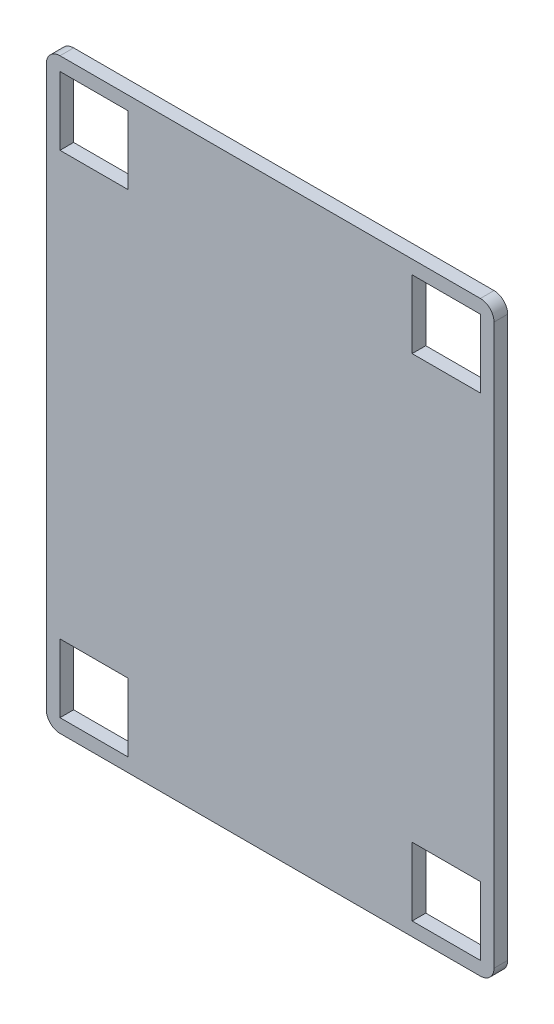
ISO-10303-21;
HEADER;
FILE_DESCRIPTION(('STEP AP214'),'2;1');
FILE_NAME('part.step','',(''),(''),'','','');
FILE_SCHEMA(('AUTOMOTIVE_DESIGN { 1 0 10303 214 1 1 1 1 }'));
ENDSEC;
DATA;
#1=APPLICATION_CONTEXT('core data for automotive mechanical design processes');
#2=APPLICATION_PROTOCOL_DEFINITION('international standard','automotive_design',2000,#1);
#3=PRODUCT_CONTEXT('',#1,'mechanical');
#4=PRODUCT('Part','Part','',(#3));
#5=PRODUCT_RELATED_PRODUCT_CATEGORY('part','',(#4));
#6=PRODUCT_DEFINITION_FORMATION('','',#4);
#7=PRODUCT_DEFINITION_CONTEXT('part definition',#1,'design');
#8=PRODUCT_DEFINITION('design','',#6,#7);
#9=PRODUCT_DEFINITION_SHAPE('','',#8);
#10=(LENGTH_UNIT() NAMED_UNIT(*) SI_UNIT(.MILLI.,.METRE.));
#11=(NAMED_UNIT(*) PLANE_ANGLE_UNIT() SI_UNIT($,.RADIAN.));
#12=(NAMED_UNIT(*) SI_UNIT($,.STERADIAN.) SOLID_ANGLE_UNIT());
#13=UNCERTAINTY_MEASURE_WITH_UNIT(LENGTH_MEASURE(1.E-05),#10,'distance_accuracy_value','');
#14=(GEOMETRIC_REPRESENTATION_CONTEXT(3) GLOBAL_UNCERTAINTY_ASSIGNED_CONTEXT((#13)) GLOBAL_UNIT_ASSIGNED_CONTEXT((#10,
#11,#12)) REPRESENTATION_CONTEXT('',''));
#15=CARTESIAN_POINT('',(0.,0.,0.));
#16=DIRECTION('',(0.,0.,1.));
#17=DIRECTION('',(1.,0.,0.));
#18=AXIS2_PLACEMENT_3D('',#15,#16,#17);
#19=CARTESIAN_POINT('',(0.,0.,5.));
#20=DIRECTION('',(0.,0.,-1.));
#21=DIRECTION('',(-1.,0.,0.));
#22=AXIS2_PLACEMENT_3D('',#19,#20,#21);
#23=PLANE('',#22);
#24=DIRECTION('',(0.,-1.,0.));
#25=VECTOR('',#24,1.);
#26=CARTESIAN_POINT('',(52.,-102.5,5.));
#27=LINE('',#26,#25);
#28=CARTESIAN_POINT('',(52.,-77.5,5.));
#29=VERTEX_POINT('',#28);
#30=CARTESIAN_POINT('',(52.,-102.5,5.));
#31=VERTEX_POINT('',#30);
#32=EDGE_CURVE('E239',#29,#31,#27,.T.);
#33=ORIENTED_EDGE('',*,*,#32,.F.);
#34=DIRECTION('',(-1.,0.,0.));
#35=VECTOR('',#34,1.);
#36=CARTESIAN_POINT('',(52.,-77.5,5.));
#37=LINE('',#36,#35);
#38=CARTESIAN_POINT('',(77.,-77.5,5.));
#39=VERTEX_POINT('',#38);
#40=EDGE_CURVE('E247',#39,#29,#37,.T.);
#41=ORIENTED_EDGE('',*,*,#40,.F.);
#42=DIRECTION('',(0.,1.,0.));
#43=VECTOR('',#42,1.);
#44=CARTESIAN_POINT('',(77.,-77.5,5.));
#45=LINE('',#44,#43);
#46=CARTESIAN_POINT('',(77.,-102.5,5.));
#47=VERTEX_POINT('',#46);
#48=EDGE_CURVE('E244',#47,#39,#45,.T.);
#49=ORIENTED_EDGE('',*,*,#48,.F.);
#50=DIRECTION('',(1.,0.,0.));
#51=VECTOR('',#50,1.);
#52=CARTESIAN_POINT('',(77.,-102.5,5.));
#53=LINE('',#52,#51);
#54=EDGE_CURVE('E241',#31,#47,#53,.T.);
#55=ORIENTED_EDGE('',*,*,#54,.F.);
#56=EDGE_LOOP('',(#33,#41,#49,#55));
#57=FACE_BOUND('',#56,.T.);
#58=DIRECTION('',(0.,-1.,0.));
#59=VECTOR('',#58,1.);
#60=CARTESIAN_POINT('',(-77.0000000000001,77.5,5.));
#61=LINE('',#60,#59);
#62=CARTESIAN_POINT('',(-77.0000000000001,102.5,5.));
#63=VERTEX_POINT('',#62);
#64=CARTESIAN_POINT('',(-77.0000000000001,77.5,5.));
#65=VERTEX_POINT('',#64);
#66=EDGE_CURVE('E300',#63,#65,#61,.T.);
#67=ORIENTED_EDGE('',*,*,#66,.F.);
#68=DIRECTION('',(-1.,0.,0.));
#69=VECTOR('',#68,1.);
#70=CARTESIAN_POINT('',(-77.0000000000001,102.5,5.));
#71=LINE('',#70,#69);
#72=CARTESIAN_POINT('',(-52.,102.5,5.));
#73=VERTEX_POINT('',#72);
#74=EDGE_CURVE('E308',#73,#63,#71,.T.);
#75=ORIENTED_EDGE('',*,*,#74,.F.);
#76=DIRECTION('',(0.,1.,0.));
#77=VECTOR('',#76,1.);
#78=CARTESIAN_POINT('',(-52.,102.5,5.));
#79=LINE('',#78,#77);
#80=CARTESIAN_POINT('',(-52.,77.5000000000001,5.));
#81=VERTEX_POINT('',#80);
#82=EDGE_CURVE('E305',#81,#73,#79,.T.);
#83=ORIENTED_EDGE('',*,*,#82,.F.);
#84=DIRECTION('',(1.,0.,0.));
#85=VECTOR('',#84,1.);
#86=CARTESIAN_POINT('',(-52.,77.5000000000001,5.));
#87=LINE('',#86,#85);
#88=EDGE_CURVE('E302',#65,#81,#87,.T.);
#89=ORIENTED_EDGE('',*,*,#88,.F.);
#90=EDGE_LOOP('',(#67,#75,#83,#89));
#91=FACE_BOUND('',#90,.T.);
#92=DIRECTION('',(0.,-1.,0.));
#93=VECTOR('',#92,1.);
#94=CARTESIAN_POINT('',(-82.,-107.5,5.));
#95=LINE('',#94,#93);
#96=CARTESIAN_POINT('',(-82.,102.5,5.));
#97=VERTEX_POINT('',#96);
#98=CARTESIAN_POINT('',(-82.,-102.5,5.));
#99=VERTEX_POINT('',#98);
#100=EDGE_CURVE('E331',#97,#99,#95,.T.);
#101=ORIENTED_EDGE('',*,*,#100,.T.);
#102=CARTESIAN_POINT('',(-77.,-102.5,5.));
#103=DIRECTION('',(0.,0.,-1.));
#104=DIRECTION('',(-1.,0.,0.));
#105=AXIS2_PLACEMENT_3D('',#102,#103,#104);
#106=CIRCLE('',#105,5.);
#107=CARTESIAN_POINT('',(-77.,-107.5,5.));
#108=VERTEX_POINT('',#107);
#109=EDGE_CURVE('E374',#99,#108,#106,.F.);
#110=ORIENTED_EDGE('',*,*,#109,.T.);
#111=DIRECTION('',(1.,0.,0.));
#112=VECTOR('',#111,1.);
#113=CARTESIAN_POINT('',(82.,-107.5,5.));
#114=LINE('',#113,#112);
#115=CARTESIAN_POINT('',(77.,-107.5,5.));
#116=VERTEX_POINT('',#115);
#117=EDGE_CURVE('E334',#108,#116,#114,.T.);
#118=ORIENTED_EDGE('',*,*,#117,.T.);
#119=CARTESIAN_POINT('',(77.,-102.5,5.));
#120=DIRECTION('',(0.,0.,-1.));
#121=DIRECTION('',(-1.,0.,0.));
#122=AXIS2_PLACEMENT_3D('',#119,#120,#121);
#123=CIRCLE('',#122,5.);
#124=CARTESIAN_POINT('',(82.,-102.5,5.));
#125=VERTEX_POINT('',#124);
#126=EDGE_CURVE('E372',#116,#125,#123,.F.);
#127=ORIENTED_EDGE('',*,*,#126,.T.);
#128=DIRECTION('',(0.,1.,0.));
#129=VECTOR('',#128,1.);
#130=CARTESIAN_POINT('',(82.,107.5,5.));
#131=LINE('',#130,#129);
#132=CARTESIAN_POINT('',(82.,102.5,5.));
#133=VERTEX_POINT('',#132);
#134=EDGE_CURVE('E338',#125,#133,#131,.T.);
#135=ORIENTED_EDGE('',*,*,#134,.T.);
#136=CARTESIAN_POINT('',(77.,102.5,5.));
#137=DIRECTION('',(0.,0.,-1.));
#138=DIRECTION('',(-1.,0.,0.));
#139=AXIS2_PLACEMENT_3D('',#136,#137,#138);
#140=CIRCLE('',#139,5.);
#141=CARTESIAN_POINT('',(77.,107.5,5.));
#142=VERTEX_POINT('',#141);
#143=EDGE_CURVE('E54',#133,#142,#140,.F.);
#144=ORIENTED_EDGE('',*,*,#143,.T.);
#145=DIRECTION('',(-1.,0.,0.));
#146=VECTOR('',#145,1.);
#147=CARTESIAN_POINT('',(-82.,107.5,5.));
#148=LINE('',#147,#146);
#149=CARTESIAN_POINT('',(-77.,107.5,5.));
#150=VERTEX_POINT('',#149);
#151=EDGE_CURVE('E340',#142,#150,#148,.T.);
#152=ORIENTED_EDGE('',*,*,#151,.T.);
#153=CARTESIAN_POINT('',(-77.,102.5,5.));
#154=DIRECTION('',(0.,0.,-1.));
#155=DIRECTION('',(-1.,0.,0.));
#156=AXIS2_PLACEMENT_3D('',#153,#154,#155);
#157=CIRCLE('',#156,5.);
#158=EDGE_CURVE('E369',#150,#97,#157,.F.);
#159=ORIENTED_EDGE('',*,*,#158,.T.);
#160=EDGE_LOOP('',(#101,#110,#118,#127,#135,#144,#152,#159));
#161=FACE_BOUND('',#160,.T.);
#162=DIRECTION('',(0.,-1.,0.));
#163=VECTOR('',#162,1.);
#164=CARTESIAN_POINT('',(52.,102.5,5.));
#165=LINE('',#164,#163);
#166=CARTESIAN_POINT('',(52.,102.5,5.));
#167=VERTEX_POINT('',#166);
#168=CARTESIAN_POINT('',(52.,77.5,5.));
#169=VERTEX_POINT('',#168);
#170=EDGE_CURVE('E196',#167,#169,#165,.T.);
#171=ORIENTED_EDGE('',*,*,#170,.F.);
#172=DIRECTION('',(-1.,0.,0.));
#173=VECTOR('',#172,1.);
#174=CARTESIAN_POINT('',(77.,102.5,5.));
#175=LINE('',#174,#173);
#176=CARTESIAN_POINT('',(77.,102.5,5.));
#177=VERTEX_POINT('',#176);
#178=EDGE_CURVE('E222',#177,#167,#175,.T.);
#179=ORIENTED_EDGE('',*,*,#178,.F.);
#180=DIRECTION('',(0.,1.,0.));
#181=VECTOR('',#180,1.);
#182=CARTESIAN_POINT('',(77.,77.5,5.));
#183=LINE('',#182,#181);
#184=CARTESIAN_POINT('',(77.,77.5,5.));
#185=VERTEX_POINT('',#184);
#186=EDGE_CURVE('E220',#185,#177,#183,.T.);
#187=ORIENTED_EDGE('',*,*,#186,.F.);
#188=DIRECTION('',(1.,0.,0.));
#189=VECTOR('',#188,1.);
#190=CARTESIAN_POINT('',(52.,77.5,5.));
#191=LINE('',#190,#189);
#192=EDGE_CURVE('E206',#169,#185,#191,.T.);
#193=ORIENTED_EDGE('',*,*,#192,.F.);
#194=EDGE_LOOP('',(#171,#179,#187,#193));
#195=FACE_BOUND('',#194,.T.);
#196=DIRECTION('',(1.,0.,0.));
#197=VECTOR('',#196,1.);
#198=CARTESIAN_POINT('',(-76.9999999999999,-102.5,5.));
#199=LINE('',#198,#197);
#200=CARTESIAN_POINT('',(-76.9999999999999,-102.5,5.));
#201=VERTEX_POINT('',#200);
#202=CARTESIAN_POINT('',(-51.9999999999999,-102.5,5.));
#203=VERTEX_POINT('',#202);
#204=EDGE_CURVE('E270',#201,#203,#199,.T.);
#205=ORIENTED_EDGE('',*,*,#204,.F.);
#206=DIRECTION('',(0.,-1.,0.));
#207=VECTOR('',#206,1.);
#208=CARTESIAN_POINT('',(-76.9999999999999,-77.5,5.));
#209=LINE('',#208,#207);
#210=CARTESIAN_POINT('',(-76.9999999999999,-77.5,5.));
#211=VERTEX_POINT('',#210);
#212=EDGE_CURVE('E278',#211,#201,#209,.T.);
#213=ORIENTED_EDGE('',*,*,#212,.F.);
#214=DIRECTION('',(-1.,0.,0.));
#215=VECTOR('',#214,1.);
#216=CARTESIAN_POINT('',(-51.9999999999999,-77.5,5.));
#217=LINE('',#216,#215);
#218=CARTESIAN_POINT('',(-51.9999999999999,-77.5,5.));
#219=VERTEX_POINT('',#218);
#220=EDGE_CURVE('E275',#219,#211,#217,.T.);
#221=ORIENTED_EDGE('',*,*,#220,.F.);
#222=DIRECTION('',(0.,1.,0.));
#223=VECTOR('',#222,1.);
#224=CARTESIAN_POINT('',(-51.9999999999999,-102.5,5.));
#225=LINE('',#224,#223);
#226=EDGE_CURVE('E272',#203,#219,#225,.T.);
#227=ORIENTED_EDGE('',*,*,#226,.F.);
#228=EDGE_LOOP('',(#205,#213,#221,#227));
#229=FACE_BOUND('',#228,.T.);
#230=ADVANCED_FACE('F33',(#57,#91,#161,#195,#229),#23,.F.);
#231=CARTESIAN_POINT('',(0.,0.,0.));
#232=DIRECTION('',(0.,0.,-1.));
#233=DIRECTION('',(-1.,0.,0.));
#234=AXIS2_PLACEMENT_3D('',#231,#232,#233);
#235=PLANE('',#234);
#236=DIRECTION('',(1.,0.,0.));
#237=VECTOR('',#236,1.);
#238=CARTESIAN_POINT('',(82.,-107.5,0.));
#239=LINE('',#238,#237);
#240=CARTESIAN_POINT('',(-77.,-107.5,0.));
#241=VERTEX_POINT('',#240);
#242=CARTESIAN_POINT('',(77.,-107.5,0.));
#243=VERTEX_POINT('',#242);
#244=EDGE_CURVE('E345',#241,#243,#239,.T.);
#245=ORIENTED_EDGE('',*,*,#244,.F.);
#246=CARTESIAN_POINT('',(-77.,-102.5,0.));
#247=DIRECTION('',(0.,0.,-1.));
#248=DIRECTION('',(-1.,0.,0.));
#249=AXIS2_PLACEMENT_3D('',#246,#247,#248);
#250=CIRCLE('',#249,5.);
#251=CARTESIAN_POINT('',(-82.,-102.5,0.));
#252=VERTEX_POINT('',#251);
#253=EDGE_CURVE('E362',#241,#252,#250,.T.);
#254=ORIENTED_EDGE('',*,*,#253,.T.);
#255=DIRECTION('',(0.,-1.,0.));
#256=VECTOR('',#255,1.);
#257=CARTESIAN_POINT('',(-82.,-107.5,0.));
#258=LINE('',#257,#256);
#259=CARTESIAN_POINT('',(-82.,102.5,0.));
#260=VERTEX_POINT('',#259);
#261=EDGE_CURVE('E330',#260,#252,#258,.T.);
#262=ORIENTED_EDGE('',*,*,#261,.F.);
#263=CARTESIAN_POINT('',(-77.,102.5,0.));
#264=DIRECTION('',(0.,0.,-1.));
#265=DIRECTION('',(-1.,0.,0.));
#266=AXIS2_PLACEMENT_3D('',#263,#264,#265);
#267=CIRCLE('',#266,5.);
#268=CARTESIAN_POINT('',(-77.,107.5,0.));
#269=VERTEX_POINT('',#268);
#270=EDGE_CURVE('E356',#260,#269,#267,.T.);
#271=ORIENTED_EDGE('',*,*,#270,.T.);
#272=DIRECTION('',(-1.,0.,0.));
#273=VECTOR('',#272,1.);
#274=CARTESIAN_POINT('',(-82.,107.5,0.));
#275=LINE('',#274,#273);
#276=CARTESIAN_POINT('',(77.,107.5,0.));
#277=VERTEX_POINT('',#276);
#278=EDGE_CURVE('E335',#277,#269,#275,.T.);
#279=ORIENTED_EDGE('',*,*,#278,.F.);
#280=CARTESIAN_POINT('',(77.,102.5,0.));
#281=DIRECTION('',(0.,0.,-1.));
#282=DIRECTION('',(-1.,0.,0.));
#283=AXIS2_PLACEMENT_3D('',#280,#281,#282);
#284=CIRCLE('',#283,5.);
#285=CARTESIAN_POINT('',(82.,102.5,0.));
#286=VERTEX_POINT('',#285);
#287=EDGE_CURVE('E358',#277,#286,#284,.T.);
#288=ORIENTED_EDGE('',*,*,#287,.T.);
#289=DIRECTION('',(0.,1.,0.));
#290=VECTOR('',#289,1.);
#291=CARTESIAN_POINT('',(82.,107.5,0.));
#292=LINE('',#291,#290);
#293=CARTESIAN_POINT('',(82.,-102.5,0.));
#294=VERTEX_POINT('',#293);
#295=EDGE_CURVE('E348',#294,#286,#292,.T.);
#296=ORIENTED_EDGE('',*,*,#295,.F.);
#297=CARTESIAN_POINT('',(77.,-102.5,0.));
#298=DIRECTION('',(0.,0.,-1.));
#299=DIRECTION('',(-1.,0.,0.));
#300=AXIS2_PLACEMENT_3D('',#297,#298,#299);
#301=CIRCLE('',#300,5.);
#302=EDGE_CURVE('E360',#294,#243,#301,.T.);
#303=ORIENTED_EDGE('',*,*,#302,.T.);
#304=EDGE_LOOP('',(#245,#254,#262,#271,#279,#288,#296,#303));
#305=FACE_BOUND('',#304,.T.);
#306=DIRECTION('',(-1.,0.,0.));
#307=VECTOR('',#306,1.);
#308=CARTESIAN_POINT('',(-77.0000000000001,102.5,0.));
#309=LINE('',#308,#307);
#310=CARTESIAN_POINT('',(-52.,102.5,0.));
#311=VERTEX_POINT('',#310);
#312=CARTESIAN_POINT('',(-77.0000000000001,102.5,0.));
#313=VERTEX_POINT('',#312);
#314=EDGE_CURVE('E303',#311,#313,#309,.T.);
#315=ORIENTED_EDGE('',*,*,#314,.T.);
#316=DIRECTION('',(0.,-1.,0.));
#317=VECTOR('',#316,1.);
#318=CARTESIAN_POINT('',(-77.0000000000001,77.5,0.));
#319=LINE('',#318,#317);
#320=CARTESIAN_POINT('',(-77.0000000000001,77.5,0.));
#321=VERTEX_POINT('',#320);
#322=EDGE_CURVE('E214',#313,#321,#319,.T.);
#323=ORIENTED_EDGE('',*,*,#322,.T.);
#324=DIRECTION('',(1.,0.,0.));
#325=VECTOR('',#324,1.);
#326=CARTESIAN_POINT('',(-52.,77.5000000000001,0.));
#327=LINE('',#326,#325);
#328=CARTESIAN_POINT('',(-52.,77.5000000000001,0.));
#329=VERTEX_POINT('',#328);
#330=EDGE_CURVE('E313',#321,#329,#327,.T.);
#331=ORIENTED_EDGE('',*,*,#330,.T.);
#332=DIRECTION('',(0.,1.,0.));
#333=VECTOR('',#332,1.);
#334=CARTESIAN_POINT('',(-52.,102.5,0.));
#335=LINE('',#334,#333);
#336=EDGE_CURVE('E316',#329,#311,#335,.T.);
#337=ORIENTED_EDGE('',*,*,#336,.T.);
#338=EDGE_LOOP('',(#315,#323,#331,#337));
#339=FACE_BOUND('',#338,.T.);
#340=DIRECTION('',(-1.,0.,0.));
#341=VECTOR('',#340,1.);
#342=CARTESIAN_POINT('',(77.,102.5,0.));
#343=LINE('',#342,#341);
#344=CARTESIAN_POINT('',(77.,102.5,0.));
#345=VERTEX_POINT('',#344);
#346=CARTESIAN_POINT('',(52.,102.5,0.));
#347=VERTEX_POINT('',#346);
#348=EDGE_CURVE('E207',#345,#347,#343,.T.);
#349=ORIENTED_EDGE('',*,*,#348,.T.);
#350=DIRECTION('',(0.,-1.,0.));
#351=VECTOR('',#350,1.);
#352=CARTESIAN_POINT('',(52.,102.5,0.));
#353=LINE('',#352,#351);
#354=CARTESIAN_POINT('',(52.,77.5,0.));
#355=VERTEX_POINT('',#354);
#356=EDGE_CURVE('E226',#347,#355,#353,.T.);
#357=ORIENTED_EDGE('',*,*,#356,.T.);
#358=DIRECTION('',(1.,0.,0.));
#359=VECTOR('',#358,1.);
#360=CARTESIAN_POINT('',(52.,77.5,0.));
#361=LINE('',#360,#359);
#362=CARTESIAN_POINT('',(77.,77.5,0.));
#363=VERTEX_POINT('',#362);
#364=EDGE_CURVE('E213',#355,#363,#361,.T.);
#365=ORIENTED_EDGE('',*,*,#364,.T.);
#366=DIRECTION('',(0.,1.,0.));
#367=VECTOR('',#366,1.);
#368=CARTESIAN_POINT('',(77.,77.5,0.));
#369=LINE('',#368,#367);
#370=EDGE_CURVE('E230',#363,#345,#369,.T.);
#371=ORIENTED_EDGE('',*,*,#370,.T.);
#372=EDGE_LOOP('',(#349,#357,#365,#371));
#373=FACE_BOUND('',#372,.T.);
#374=DIRECTION('',(-1.,0.,0.));
#375=VECTOR('',#374,1.);
#376=CARTESIAN_POINT('',(52.,-77.5,0.));
#377=LINE('',#376,#375);
#378=CARTESIAN_POINT('',(77.,-77.5,0.));
#379=VERTEX_POINT('',#378);
#380=CARTESIAN_POINT('',(52.,-77.5,0.));
#381=VERTEX_POINT('',#380);
#382=EDGE_CURVE('E242',#379,#381,#377,.T.);
#383=ORIENTED_EDGE('',*,*,#382,.T.);
#384=DIRECTION('',(0.,-1.,0.));
#385=VECTOR('',#384,1.);
#386=CARTESIAN_POINT('',(52.,-102.5,0.));
#387=LINE('',#386,#385);
#388=CARTESIAN_POINT('',(52.,-102.5,0.));
#389=VERTEX_POINT('',#388);
#390=EDGE_CURVE('E250',#381,#389,#387,.T.);
#391=ORIENTED_EDGE('',*,*,#390,.T.);
#392=DIRECTION('',(1.,0.,0.));
#393=VECTOR('',#392,1.);
#394=CARTESIAN_POINT('',(77.,-102.5,0.));
#395=LINE('',#394,#393);
#396=CARTESIAN_POINT('',(77.,-102.5,0.));
#397=VERTEX_POINT('',#396);
#398=EDGE_CURVE('E253',#389,#397,#395,.T.);
#399=ORIENTED_EDGE('',*,*,#398,.T.);
#400=DIRECTION('',(0.,1.,0.));
#401=VECTOR('',#400,1.);
#402=CARTESIAN_POINT('',(77.,-77.5,0.));
#403=LINE('',#402,#401);
#404=EDGE_CURVE('E257',#397,#379,#403,.T.);
#405=ORIENTED_EDGE('',*,*,#404,.T.);
#406=EDGE_LOOP('',(#383,#391,#399,#405));
#407=FACE_BOUND('',#406,.T.);
#408=DIRECTION('',(0.,-1.,0.));
#409=VECTOR('',#408,1.);
#410=CARTESIAN_POINT('',(-76.9999999999999,-77.5,0.));
#411=LINE('',#410,#409);
#412=CARTESIAN_POINT('',(-76.9999999999999,-77.5,0.));
#413=VERTEX_POINT('',#412);
#414=CARTESIAN_POINT('',(-76.9999999999999,-102.5,0.));
#415=VERTEX_POINT('',#414);
#416=EDGE_CURVE('E273',#413,#415,#411,.T.);
#417=ORIENTED_EDGE('',*,*,#416,.T.);
#418=DIRECTION('',(1.,0.,0.));
#419=VECTOR('',#418,1.);
#420=CARTESIAN_POINT('',(-76.9999999999999,-102.5,0.));
#421=LINE('',#420,#419);
#422=CARTESIAN_POINT('',(-51.9999999999999,-102.5,0.));
#423=VERTEX_POINT('',#422);
#424=EDGE_CURVE('E281',#415,#423,#421,.T.);
#425=ORIENTED_EDGE('',*,*,#424,.T.);
#426=DIRECTION('',(0.,1.,0.));
#427=VECTOR('',#426,1.);
#428=CARTESIAN_POINT('',(-51.9999999999999,-102.5,0.));
#429=LINE('',#428,#427);
#430=CARTESIAN_POINT('',(-51.9999999999999,-77.5,0.));
#431=VERTEX_POINT('',#430);
#432=EDGE_CURVE('E284',#423,#431,#429,.T.);
#433=ORIENTED_EDGE('',*,*,#432,.T.);
#434=DIRECTION('',(-1.,0.,0.));
#435=VECTOR('',#434,1.);
#436=CARTESIAN_POINT('',(-51.9999999999999,-77.5,0.));
#437=LINE('',#436,#435);
#438=EDGE_CURVE('E287',#431,#413,#437,.T.);
#439=ORIENTED_EDGE('',*,*,#438,.T.);
#440=EDGE_LOOP('',(#417,#425,#433,#439));
#441=FACE_BOUND('',#440,.T.);
#442=ADVANCED_FACE('F390',(#305,#339,#373,#407,#441),#235,.T.);
#443=CARTESIAN_POINT('',(-82.,-107.5,5.));
#444=DIRECTION('',(1.,0.,0.));
#445=DIRECTION('',(0.,0.,-1.));
#446=AXIS2_PLACEMENT_3D('',#443,#444,#445);
#447=PLANE('',#446);
#448=ORIENTED_EDGE('',*,*,#261,.T.);
#449=DIRECTION('',(0.,0.,-1.));
#450=VECTOR('',#449,1.);
#451=CARTESIAN_POINT('',(-82.,-102.5,5.));
#452=LINE('',#451,#450);
#453=EDGE_CURVE('E367',#252,#99,#452,.F.);
#454=ORIENTED_EDGE('',*,*,#453,.T.);
#455=ORIENTED_EDGE('',*,*,#100,.F.);
#456=DIRECTION('',(0.,0.,-1.));
#457=VECTOR('',#456,1.);
#458=CARTESIAN_POINT('',(-82.,102.5,5.));
#459=LINE('',#458,#457);
#460=EDGE_CURVE('E364',#97,#260,#459,.T.);
#461=ORIENTED_EDGE('',*,*,#460,.T.);
#462=EDGE_LOOP('',(#448,#454,#455,#461));
#463=FACE_BOUND('',#462,.T.);
#464=ADVANCED_FACE('F403',(#463),#447,.F.);
#465=CARTESIAN_POINT('',(82.,-107.5,5.));
#466=DIRECTION('',(0.,1.,0.));
#467=DIRECTION('',(0.,0.,1.));
#468=AXIS2_PLACEMENT_3D('',#465,#466,#467);
#469=PLANE('',#468);
#470=ORIENTED_EDGE('',*,*,#117,.F.);
#471=DIRECTION('',(0.,0.,-1.));
#472=VECTOR('',#471,1.);
#473=CARTESIAN_POINT('',(-77.,-107.5,5.));
#474=LINE('',#473,#472);
#475=EDGE_CURVE('E353',#108,#241,#474,.T.);
#476=ORIENTED_EDGE('',*,*,#475,.T.);
#477=ORIENTED_EDGE('',*,*,#244,.T.);
#478=DIRECTION('',(0.,0.,-1.));
#479=VECTOR('',#478,1.);
#480=CARTESIAN_POINT('',(77.,-107.5,5.));
#481=LINE('',#480,#479);
#482=EDGE_CURVE('E342',#243,#116,#481,.F.);
#483=ORIENTED_EDGE('',*,*,#482,.T.);
#484=EDGE_LOOP('',(#470,#476,#477,#483));
#485=FACE_BOUND('',#484,.T.);
#486=ADVANCED_FACE('F411',(#485),#469,.F.);
#487=CARTESIAN_POINT('',(82.,107.5,5.));
#488=DIRECTION('',(-1.,0.,0.));
#489=DIRECTION('',(0.,-1.,0.));
#490=AXIS2_PLACEMENT_3D('',#487,#488,#489);
#491=PLANE('',#490);
#492=ORIENTED_EDGE('',*,*,#134,.F.);
#493=DIRECTION('',(0.,0.,-1.));
#494=VECTOR('',#493,1.);
#495=CARTESIAN_POINT('',(82.,-102.5,5.));
#496=LINE('',#495,#494);
#497=EDGE_CURVE('E378',#125,#294,#496,.T.);
#498=ORIENTED_EDGE('',*,*,#497,.T.);
#499=ORIENTED_EDGE('',*,*,#295,.T.);
#500=DIRECTION('',(0.,0.,-1.));
#501=VECTOR('',#500,1.);
#502=CARTESIAN_POINT('',(82.,102.5,5.));
#503=LINE('',#502,#501);
#504=EDGE_CURVE('E376',#286,#133,#503,.F.);
#505=ORIENTED_EDGE('',*,*,#504,.T.);
#506=EDGE_LOOP('',(#492,#498,#499,#505));
#507=FACE_BOUND('',#506,.T.);
#508=ADVANCED_FACE('F384',(#507),#491,.F.);
#509=CARTESIAN_POINT('',(-82.,107.5,5.));
#510=DIRECTION('',(0.,-1.,0.));
#511=DIRECTION('',(0.,0.,-1.));
#512=AXIS2_PLACEMENT_3D('',#509,#510,#511);
#513=PLANE('',#512);
#514=ORIENTED_EDGE('',*,*,#151,.F.);
#515=DIRECTION('',(0.,0.,-1.));
#516=VECTOR('',#515,1.);
#517=CARTESIAN_POINT('',(77.,107.5,5.));
#518=LINE('',#517,#516);
#519=EDGE_CURVE('E11',#142,#277,#518,.T.);
#520=ORIENTED_EDGE('',*,*,#519,.T.);
#521=ORIENTED_EDGE('',*,*,#278,.T.);
#522=DIRECTION('',(0.,0.,-1.));
#523=VECTOR('',#522,1.);
#524=CARTESIAN_POINT('',(-77.,107.5,5.));
#525=LINE('',#524,#523);
#526=EDGE_CURVE('E41',#269,#150,#525,.F.);
#527=ORIENTED_EDGE('',*,*,#526,.T.);
#528=EDGE_LOOP('',(#514,#520,#521,#527));
#529=FACE_BOUND('',#528,.T.);
#530=ADVANCED_FACE('F396',(#529),#513,.F.);
#531=CARTESIAN_POINT('',(-77.0000000000001,77.5,5.));
#532=DIRECTION('',(1.,0.,0.));
#533=DIRECTION('',(0.,0.,-1.));
#534=AXIS2_PLACEMENT_3D('',#531,#532,#533);
#535=PLANE('',#534);
#536=ORIENTED_EDGE('',*,*,#322,.F.);
#537=DIRECTION('',(0.,0.,-1.));
#538=VECTOR('',#537,1.);
#539=CARTESIAN_POINT('',(-77.0000000000001,102.5,5.));
#540=LINE('',#539,#538);
#541=EDGE_CURVE('E310',#63,#313,#540,.T.);
#542=ORIENTED_EDGE('',*,*,#541,.F.);
#543=ORIENTED_EDGE('',*,*,#66,.T.);
#544=DIRECTION('',(0.,0.,-1.));
#545=VECTOR('',#544,1.);
#546=CARTESIAN_POINT('',(-77.0000000000001,77.5,5.));
#547=LINE('',#546,#545);
#548=EDGE_CURVE('E327',#65,#321,#547,.T.);
#549=ORIENTED_EDGE('',*,*,#548,.T.);
#550=EDGE_LOOP('',(#536,#542,#543,#549));
#551=FACE_BOUND('',#550,.T.);
#552=ADVANCED_FACE('F433',(#551),#535,.T.);
#553=CARTESIAN_POINT('',(-52.,77.5000000000001,5.));
#554=DIRECTION('',(0.,1.,0.));
#555=DIRECTION('',(-1.,0.,0.));
#556=AXIS2_PLACEMENT_3D('',#553,#554,#555);
#557=PLANE('',#556);
#558=ORIENTED_EDGE('',*,*,#330,.F.);
#559=ORIENTED_EDGE('',*,*,#548,.F.);
#560=ORIENTED_EDGE('',*,*,#88,.T.);
#561=DIRECTION('',(0.,0.,-1.));
#562=VECTOR('',#561,1.);
#563=CARTESIAN_POINT('',(-52.,77.5000000000001,5.));
#564=LINE('',#563,#562);
#565=EDGE_CURVE('E325',#81,#329,#564,.T.);
#566=ORIENTED_EDGE('',*,*,#565,.T.);
#567=EDGE_LOOP('',(#558,#559,#560,#566));
#568=FACE_BOUND('',#567,.T.);
#569=ADVANCED_FACE('F588',(#568),#557,.T.);
#570=CARTESIAN_POINT('',(-52.,102.5,5.));
#571=DIRECTION('',(-1.,0.,0.));
#572=DIRECTION('',(0.,0.,1.));
#573=AXIS2_PLACEMENT_3D('',#570,#571,#572);
#574=PLANE('',#573);
#575=ORIENTED_EDGE('',*,*,#336,.F.);
#576=ORIENTED_EDGE('',*,*,#565,.F.);
#577=ORIENTED_EDGE('',*,*,#82,.T.);
#578=DIRECTION('',(0.,0.,-1.));
#579=VECTOR('',#578,1.);
#580=CARTESIAN_POINT('',(-52.,102.5,5.));
#581=LINE('',#580,#579);
#582=EDGE_CURVE('E323',#73,#311,#581,.T.);
#583=ORIENTED_EDGE('',*,*,#582,.T.);
#584=EDGE_LOOP('',(#575,#576,#577,#583));
#585=FACE_BOUND('',#584,.T.);
#586=ADVANCED_FACE('F580',(#585),#574,.T.);
#587=CARTESIAN_POINT('',(-77.0000000000001,102.5,5.));
#588=DIRECTION('',(0.,-1.,0.));
#589=DIRECTION('',(1.,0.,0.));
#590=AXIS2_PLACEMENT_3D('',#587,#588,#589);
#591=PLANE('',#590);
#592=ORIENTED_EDGE('',*,*,#314,.F.);
#593=ORIENTED_EDGE('',*,*,#582,.F.);
#594=ORIENTED_EDGE('',*,*,#74,.T.);
#595=ORIENTED_EDGE('',*,*,#541,.T.);
#596=EDGE_LOOP('',(#592,#593,#594,#595));
#597=FACE_BOUND('',#596,.T.);
#598=ADVANCED_FACE('F573',(#597),#591,.T.);
#599=CARTESIAN_POINT('',(52.,102.5,5.));
#600=DIRECTION('',(1.,0.,0.));
#601=DIRECTION('',(0.,0.,-1.));
#602=AXIS2_PLACEMENT_3D('',#599,#600,#601);
#603=PLANE('',#602);
#604=ORIENTED_EDGE('',*,*,#356,.F.);
#605=DIRECTION('',(0.,0.,-1.));
#606=VECTOR('',#605,1.);
#607=CARTESIAN_POINT('',(52.,102.5,5.));
#608=LINE('',#607,#606);
#609=EDGE_CURVE('E202',#167,#347,#608,.T.);
#610=ORIENTED_EDGE('',*,*,#609,.F.);
#611=ORIENTED_EDGE('',*,*,#170,.T.);
#612=DIRECTION('',(0.,0.,-1.));
#613=VECTOR('',#612,1.);
#614=CARTESIAN_POINT('',(52.,77.5,5.));
#615=LINE('',#614,#613);
#616=EDGE_CURVE('E199',#169,#355,#615,.T.);
#617=ORIENTED_EDGE('',*,*,#616,.T.);
#618=EDGE_LOOP('',(#604,#610,#611,#617));
#619=FACE_BOUND('',#618,.T.);
#620=ADVANCED_FACE('F198',(#619),#603,.T.);
#621=CARTESIAN_POINT('',(52.,77.5,5.));
#622=DIRECTION('',(0.,1.,0.));
#623=DIRECTION('',(0.,0.,1.));
#624=AXIS2_PLACEMENT_3D('',#621,#622,#623);
#625=PLANE('',#624);
#626=ORIENTED_EDGE('',*,*,#364,.F.);
#627=ORIENTED_EDGE('',*,*,#616,.F.);
#628=ORIENTED_EDGE('',*,*,#192,.T.);
#629=DIRECTION('',(0.,0.,-1.));
#630=VECTOR('',#629,1.);
#631=CARTESIAN_POINT('',(77.,77.5,5.));
#632=LINE('',#631,#630);
#633=EDGE_CURVE('E215',#185,#363,#632,.T.);
#634=ORIENTED_EDGE('',*,*,#633,.T.);
#635=EDGE_LOOP('',(#626,#627,#628,#634));
#636=FACE_BOUND('',#635,.T.);
#637=ADVANCED_FACE('F210',(#636),#625,.T.);
#638=CARTESIAN_POINT('',(77.,77.5,5.));
#639=DIRECTION('',(-1.,0.,0.));
#640=DIRECTION('',(0.,0.,1.));
#641=AXIS2_PLACEMENT_3D('',#638,#639,#640);
#642=PLANE('',#641);
#643=ORIENTED_EDGE('',*,*,#370,.F.);
#644=ORIENTED_EDGE('',*,*,#633,.F.);
#645=ORIENTED_EDGE('',*,*,#186,.T.);
#646=DIRECTION('',(0.,0.,-1.));
#647=VECTOR('',#646,1.);
#648=CARTESIAN_POINT('',(77.,102.5,5.));
#649=LINE('',#648,#647);
#650=EDGE_CURVE('E236',#177,#345,#649,.T.);
#651=ORIENTED_EDGE('',*,*,#650,.T.);
#652=EDGE_LOOP('',(#643,#644,#645,#651));
#653=FACE_BOUND('',#652,.T.);
#654=ADVANCED_FACE('F552',(#653),#642,.T.);
#655=CARTESIAN_POINT('',(77.,102.5,5.));
#656=DIRECTION('',(0.,-1.,0.));
#657=DIRECTION('',(1.,0.,0.));
#658=AXIS2_PLACEMENT_3D('',#655,#656,#657);
#659=PLANE('',#658);
#660=ORIENTED_EDGE('',*,*,#348,.F.);
#661=ORIENTED_EDGE('',*,*,#650,.F.);
#662=ORIENTED_EDGE('',*,*,#178,.T.);
#663=ORIENTED_EDGE('',*,*,#609,.T.);
#664=EDGE_LOOP('',(#660,#661,#662,#663));
#665=FACE_BOUND('',#664,.T.);
#666=ADVANCED_FACE('F544',(#665),#659,.T.);
#667=CARTESIAN_POINT('',(52.,-102.5,5.));
#668=DIRECTION('',(1.,0.,0.));
#669=DIRECTION('',(0.,0.,-1.));
#670=AXIS2_PLACEMENT_3D('',#667,#668,#669);
#671=PLANE('',#670);
#672=ORIENTED_EDGE('',*,*,#390,.F.);
#673=DIRECTION('',(0.,0.,-1.));
#674=VECTOR('',#673,1.);
#675=CARTESIAN_POINT('',(52.,-77.5,5.));
#676=LINE('',#675,#674);
#677=EDGE_CURVE('E249',#29,#381,#676,.T.);
#678=ORIENTED_EDGE('',*,*,#677,.F.);
#679=ORIENTED_EDGE('',*,*,#32,.T.);
#680=DIRECTION('',(0.,0.,-1.));
#681=VECTOR('',#680,1.);
#682=CARTESIAN_POINT('',(52.,-102.5,5.));
#683=LINE('',#682,#681);
#684=EDGE_CURVE('E228',#31,#389,#683,.T.);
#685=ORIENTED_EDGE('',*,*,#684,.T.);
#686=EDGE_LOOP('',(#672,#678,#679,#685));
#687=FACE_BOUND('',#686,.T.);
#688=ADVANCED_FACE('F536',(#687),#671,.T.);
#689=CARTESIAN_POINT('',(77.,-102.5,5.));
#690=DIRECTION('',(0.,1.,0.));
#691=DIRECTION('',(-1.,0.,0.));
#692=AXIS2_PLACEMENT_3D('',#689,#690,#691);
#693=PLANE('',#692);
#694=ORIENTED_EDGE('',*,*,#398,.F.);
#695=ORIENTED_EDGE('',*,*,#684,.F.);
#696=ORIENTED_EDGE('',*,*,#54,.T.);
#697=DIRECTION('',(0.,0.,-1.));
#698=VECTOR('',#697,1.);
#699=CARTESIAN_POINT('',(77.,-102.5,5.));
#700=LINE('',#699,#698);
#701=EDGE_CURVE('E266',#47,#397,#700,.T.);
#702=ORIENTED_EDGE('',*,*,#701,.T.);
#703=EDGE_LOOP('',(#694,#695,#696,#702));
#704=FACE_BOUND('',#703,.T.);
#705=ADVANCED_FACE('F528',(#704),#693,.T.);
#706=CARTESIAN_POINT('',(77.,-77.5,5.));
#707=DIRECTION('',(-1.,0.,0.));
#708=DIRECTION('',(0.,0.,1.));
#709=AXIS2_PLACEMENT_3D('',#706,#707,#708);
#710=PLANE('',#709);
#711=ORIENTED_EDGE('',*,*,#404,.F.);
#712=ORIENTED_EDGE('',*,*,#701,.F.);
#713=ORIENTED_EDGE('',*,*,#48,.T.);
#714=DIRECTION('',(0.,0.,-1.));
#715=VECTOR('',#714,1.);
#716=CARTESIAN_POINT('',(77.,-77.5,5.));
#717=LINE('',#716,#715);
#718=EDGE_CURVE('E264',#39,#379,#717,.T.);
#719=ORIENTED_EDGE('',*,*,#718,.T.);
#720=EDGE_LOOP('',(#711,#712,#713,#719));
#721=FACE_BOUND('',#720,.T.);
#722=ADVANCED_FACE('F520',(#721),#710,.T.);
#723=CARTESIAN_POINT('',(52.,-77.5,5.));
#724=DIRECTION('',(0.,-1.,0.));
#725=DIRECTION('',(0.,0.,-1.));
#726=AXIS2_PLACEMENT_3D('',#723,#724,#725);
#727=PLANE('',#726);
#728=ORIENTED_EDGE('',*,*,#382,.F.);
#729=ORIENTED_EDGE('',*,*,#718,.F.);
#730=ORIENTED_EDGE('',*,*,#40,.T.);
#731=ORIENTED_EDGE('',*,*,#677,.T.);
#732=EDGE_LOOP('',(#728,#729,#730,#731));
#733=FACE_BOUND('',#732,.T.);
#734=ADVANCED_FACE('F512',(#733),#727,.T.);
#735=CARTESIAN_POINT('',(-76.9999999999999,-102.5,5.));
#736=DIRECTION('',(0.,1.,0.));
#737=DIRECTION('',(-1.,0.,0.));
#738=AXIS2_PLACEMENT_3D('',#735,#736,#737);
#739=PLANE('',#738);
#740=ORIENTED_EDGE('',*,*,#424,.F.);
#741=DIRECTION('',(0.,0.,-1.));
#742=VECTOR('',#741,1.);
#743=CARTESIAN_POINT('',(-76.9999999999999,-102.5,5.));
#744=LINE('',#743,#742);
#745=EDGE_CURVE('E280',#201,#415,#744,.T.);
#746=ORIENTED_EDGE('',*,*,#745,.F.);
#747=ORIENTED_EDGE('',*,*,#204,.T.);
#748=DIRECTION('',(0.,0.,-1.));
#749=VECTOR('',#748,1.);
#750=CARTESIAN_POINT('',(-51.9999999999999,-102.5,5.));
#751=LINE('',#750,#749);
#752=EDGE_CURVE('E254',#203,#423,#751,.T.);
#753=ORIENTED_EDGE('',*,*,#752,.T.);
#754=EDGE_LOOP('',(#740,#746,#747,#753));
#755=FACE_BOUND('',#754,.T.);
#756=ADVANCED_FACE('F504',(#755),#739,.T.);
#757=CARTESIAN_POINT('',(-51.9999999999999,-102.5,5.));
#758=DIRECTION('',(-1.,0.,0.));
#759=DIRECTION('',(0.,0.,1.));
#760=AXIS2_PLACEMENT_3D('',#757,#758,#759);
#761=PLANE('',#760);
#762=ORIENTED_EDGE('',*,*,#432,.F.);
#763=ORIENTED_EDGE('',*,*,#752,.F.);
#764=ORIENTED_EDGE('',*,*,#226,.T.);
#765=DIRECTION('',(0.,0.,-1.));
#766=VECTOR('',#765,1.);
#767=CARTESIAN_POINT('',(-51.9999999999999,-77.5,5.));
#768=LINE('',#767,#766);
#769=EDGE_CURVE('E296',#219,#431,#768,.T.);
#770=ORIENTED_EDGE('',*,*,#769,.T.);
#771=EDGE_LOOP('',(#762,#763,#764,#770));
#772=FACE_BOUND('',#771,.T.);
#773=ADVANCED_FACE('F496',(#772),#761,.T.);
#774=CARTESIAN_POINT('',(-51.9999999999999,-77.5,5.));
#775=DIRECTION('',(0.,-1.,0.));
#776=DIRECTION('',(1.,0.,0.));
#777=AXIS2_PLACEMENT_3D('',#774,#775,#776);
#778=PLANE('',#777);
#779=ORIENTED_EDGE('',*,*,#438,.F.);
#780=ORIENTED_EDGE('',*,*,#769,.F.);
#781=ORIENTED_EDGE('',*,*,#220,.T.);
#782=DIRECTION('',(0.,0.,-1.));
#783=VECTOR('',#782,1.);
#784=CARTESIAN_POINT('',(-76.9999999999999,-77.5,5.));
#785=LINE('',#784,#783);
#786=EDGE_CURVE('E294',#211,#413,#785,.T.);
#787=ORIENTED_EDGE('',*,*,#786,.T.);
#788=EDGE_LOOP('',(#779,#780,#781,#787));
#789=FACE_BOUND('',#788,.T.);
#790=ADVANCED_FACE('F489',(#789),#778,.T.);
#791=CARTESIAN_POINT('',(-76.9999999999999,-77.5,5.));
#792=DIRECTION('',(1.,0.,0.));
#793=DIRECTION('',(0.,0.,-1.));
#794=AXIS2_PLACEMENT_3D('',#791,#792,#793);
#795=PLANE('',#794);
#796=ORIENTED_EDGE('',*,*,#416,.F.);
#797=ORIENTED_EDGE('',*,*,#786,.F.);
#798=ORIENTED_EDGE('',*,*,#212,.T.);
#799=ORIENTED_EDGE('',*,*,#745,.T.);
#800=EDGE_LOOP('',(#796,#797,#798,#799));
#801=FACE_BOUND('',#800,.T.);
#802=ADVANCED_FACE('F420',(#801),#795,.T.);
#803=CARTESIAN_POINT('',(-77.,-102.5,5.));
#804=DIRECTION('',(0.,0.,-1.));
#805=DIRECTION('',(-1.,0.,0.));
#806=AXIS2_PLACEMENT_3D('',#803,#804,#805);
#807=CYLINDRICAL_SURFACE('',#806,5.);
#808=ORIENTED_EDGE('',*,*,#109,.F.);
#809=ORIENTED_EDGE('',*,*,#453,.F.);
#810=ORIENTED_EDGE('',*,*,#253,.F.);
#811=ORIENTED_EDGE('',*,*,#475,.F.);
#812=EDGE_LOOP('',(#808,#809,#810,#811));
#813=FACE_BOUND('',#812,.T.);
#814=ADVANCED_FACE('F408',(#813),#807,.T.);
#815=CARTESIAN_POINT('',(77.,-102.5,5.));
#816=DIRECTION('',(0.,0.,-1.));
#817=DIRECTION('',(-1.,0.,0.));
#818=AXIS2_PLACEMENT_3D('',#815,#816,#817);
#819=CYLINDRICAL_SURFACE('',#818,5.);
#820=ORIENTED_EDGE('',*,*,#126,.F.);
#821=ORIENTED_EDGE('',*,*,#482,.F.);
#822=ORIENTED_EDGE('',*,*,#302,.F.);
#823=ORIENTED_EDGE('',*,*,#497,.F.);
#824=EDGE_LOOP('',(#820,#821,#822,#823));
#825=FACE_BOUND('',#824,.T.);
#826=ADVANCED_FACE('F413',(#825),#819,.T.);
#827=CARTESIAN_POINT('',(77.,102.5,5.));
#828=DIRECTION('',(0.,0.,-1.));
#829=DIRECTION('',(-1.,0.,0.));
#830=AXIS2_PLACEMENT_3D('',#827,#828,#829);
#831=CYLINDRICAL_SURFACE('',#830,5.);
#832=ORIENTED_EDGE('',*,*,#143,.F.);
#833=ORIENTED_EDGE('',*,*,#504,.F.);
#834=ORIENTED_EDGE('',*,*,#287,.F.);
#835=ORIENTED_EDGE('',*,*,#519,.F.);
#836=EDGE_LOOP('',(#832,#833,#834,#835));
#837=FACE_BOUND('',#836,.T.);
#838=ADVANCED_FACE('F395',(#837),#831,.T.);
#839=CARTESIAN_POINT('',(-77.,102.5,5.));
#840=DIRECTION('',(0.,0.,-1.));
#841=DIRECTION('',(-1.,0.,0.));
#842=AXIS2_PLACEMENT_3D('',#839,#840,#841);
#843=CYLINDRICAL_SURFACE('',#842,5.);
#844=ORIENTED_EDGE('',*,*,#158,.F.);
#845=ORIENTED_EDGE('',*,*,#526,.F.);
#846=ORIENTED_EDGE('',*,*,#270,.F.);
#847=ORIENTED_EDGE('',*,*,#460,.F.);
#848=EDGE_LOOP('',(#844,#845,#846,#847));
#849=FACE_BOUND('',#848,.T.);
#850=ADVANCED_FACE('F35',(#849),#843,.T.);
#851=CLOSED_SHELL('',(#230,#442,#464,#486,#508,#530,#552,#569,#586,#598,#620,#637,#654,#666,
#688,#705,#722,#734,#756,#773,#790,#802,#814,#826,#838,#850));
#852=MANIFOLD_SOLID_BREP('B2',#851);
#853=ADVANCED_BREP_SHAPE_REPRESENTATION('',(#18,#852),#14);
#854=SHAPE_DEFINITION_REPRESENTATION(#9,#853);
ENDSEC;
END-ISO-10303-21;
